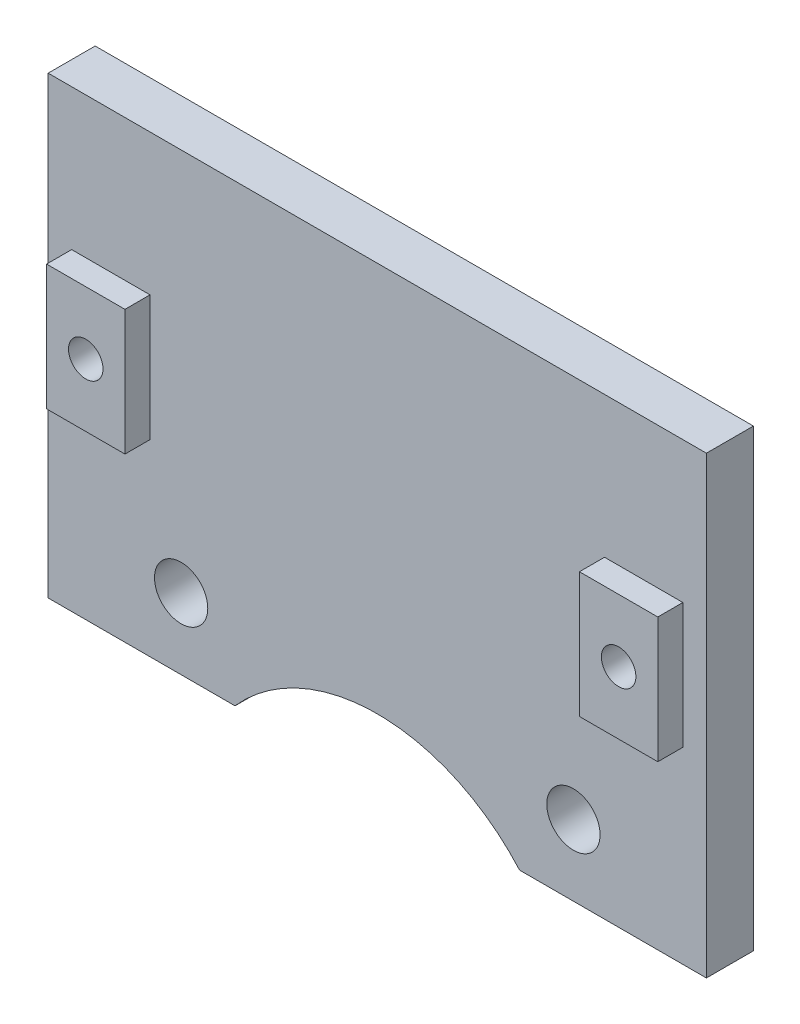
ISO-10303-21;
HEADER;
FILE_DESCRIPTION(('STEP AP214'),'2;1');
FILE_NAME('part.step','',(''),(''),'','','');
FILE_SCHEMA(('AUTOMOTIVE_DESIGN { 1 0 10303 214 1 1 1 1 }'));
ENDSEC;
DATA;
#1=APPLICATION_CONTEXT('core data for automotive mechanical design processes');
#2=APPLICATION_PROTOCOL_DEFINITION('international standard','automotive_design',2000,#1);
#3=PRODUCT_CONTEXT('',#1,'mechanical');
#4=PRODUCT('Part','Part','',(#3));
#5=PRODUCT_RELATED_PRODUCT_CATEGORY('part','',(#4));
#6=PRODUCT_DEFINITION_FORMATION('','',#4);
#7=PRODUCT_DEFINITION_CONTEXT('part definition',#1,'design');
#8=PRODUCT_DEFINITION('design','',#6,#7);
#9=PRODUCT_DEFINITION_SHAPE('','',#8);
#10=(LENGTH_UNIT() NAMED_UNIT(*) SI_UNIT(.MILLI.,.METRE.));
#11=(NAMED_UNIT(*) PLANE_ANGLE_UNIT() SI_UNIT($,.RADIAN.));
#12=(NAMED_UNIT(*) SI_UNIT($,.STERADIAN.) SOLID_ANGLE_UNIT());
#13=UNCERTAINTY_MEASURE_WITH_UNIT(LENGTH_MEASURE(1.E-05),#10,'distance_accuracy_value','');
#14=(GEOMETRIC_REPRESENTATION_CONTEXT(3) GLOBAL_UNCERTAINTY_ASSIGNED_CONTEXT((#13)) GLOBAL_UNIT_ASSIGNED_CONTEXT((#10,
#11,#12)) REPRESENTATION_CONTEXT('',''));
#15=CARTESIAN_POINT('',(0.,0.,0.));
#16=DIRECTION('',(0.,0.,1.));
#17=DIRECTION('',(1.,0.,0.));
#18=AXIS2_PLACEMENT_3D('',#15,#16,#17);
#19=CARTESIAN_POINT('',(0.,0.,3.));
#20=DIRECTION('',(0.,0.,1.));
#21=DIRECTION('',(1.,0.,0.));
#22=AXIS2_PLACEMENT_3D('',#19,#20,#21);
#23=PLANE('',#22);
#24=CARTESIAN_POINT('',(12.5157900270019,-11.4842099729981,3.));
#25=DIRECTION('',(0.,0.,1.));
#26=DIRECTION('',(1.,0.,0.));
#27=AXIS2_PLACEMENT_3D('',#24,#25,#26);
#28=CIRCLE('',#27,1.7);
#29=CARTESIAN_POINT('',(14.2157900270019,-11.4842099729981,3.));
#30=VERTEX_POINT('',#29);
#31=EDGE_CURVE('E199',#30,#30,#28,.F.);
#32=ORIENTED_EDGE('',*,*,#31,.T.);
#33=EDGE_LOOP('',(#32));
#34=FACE_BOUND('',#33,.T.);
#35=CARTESIAN_POINT('',(-12.5157900270019,-11.4842099729981,3.));
#36=DIRECTION('',(0.,0.,1.));
#37=DIRECTION('',(1.,0.,0.));
#38=AXIS2_PLACEMENT_3D('',#35,#36,#37);
#39=CIRCLE('',#38,1.7);
#40=CARTESIAN_POINT('',(-10.8157900270019,-11.4842099729981,3.));
#41=VERTEX_POINT('',#40);
#42=EDGE_CURVE('E203',#41,#41,#39,.F.);
#43=ORIENTED_EDGE('',*,*,#42,.T.);
#44=EDGE_LOOP('',(#43));
#45=FACE_BOUND('',#44,.T.);
#46=DIRECTION('',(1.,0.,0.));
#47=VECTOR('',#46,1.);
#48=CARTESIAN_POINT('',(-21.,-16.,3.));
#49=LINE('',#48,#47);
#50=CARTESIAN_POINT('',(-21.,-16.,3.));
#51=VERTEX_POINT('',#50);
#52=CARTESIAN_POINT('',(-9.07799537342909,-16.,3.));
#53=VERTEX_POINT('',#52);
#54=EDGE_CURVE('E219',#51,#53,#49,.T.);
#55=ORIENTED_EDGE('',*,*,#54,.T.);
#56=CARTESIAN_POINT('',(0.,-24.,3.));
#57=DIRECTION('',(0.,0.,1.));
#58=DIRECTION('',(1.,0.,0.));
#59=AXIS2_PLACEMENT_3D('',#56,#57,#58);
#60=CIRCLE('',#59,12.1);
#61=CARTESIAN_POINT('',(9.07799537342909,-16.,3.));
#62=VERTEX_POINT('',#61);
#63=EDGE_CURVE('E206',#53,#62,#60,.F.);
#64=ORIENTED_EDGE('',*,*,#63,.T.);
#65=CARTESIAN_POINT('',(21.,-16.,3.));
#66=VERTEX_POINT('',#65);
#67=EDGE_CURVE('E213',#62,#66,#49,.T.);
#68=ORIENTED_EDGE('',*,*,#67,.T.);
#69=DIRECTION('',(0.,1.,0.));
#70=VECTOR('',#69,1.);
#71=CARTESIAN_POINT('',(21.,-16.,3.));
#72=LINE('',#71,#70);
#73=CARTESIAN_POINT('',(21.,13.,3.));
#74=VERTEX_POINT('',#73);
#75=EDGE_CURVE('E216',#66,#74,#72,.T.);
#76=ORIENTED_EDGE('',*,*,#75,.T.);
#77=DIRECTION('',(-1.,0.,0.));
#78=VECTOR('',#77,1.);
#79=CARTESIAN_POINT('',(21.,13.,3.));
#80=LINE('',#79,#78);
#81=CARTESIAN_POINT('',(-21.,13.,3.));
#82=VERTEX_POINT('',#81);
#83=EDGE_CURVE('E225',#74,#82,#80,.T.);
#84=ORIENTED_EDGE('',*,*,#83,.T.);
#85=DIRECTION('',(0.,-1.,0.));
#86=VECTOR('',#85,1.);
#87=CARTESIAN_POINT('',(-21.,13.,3.));
#88=LINE('',#87,#86);
#89=EDGE_CURVE('E215',#82,#51,#88,.T.);
#90=ORIENTED_EDGE('',*,*,#89,.T.);
#91=EDGE_LOOP('',(#55,#64,#68,#76,#84,#90));
#92=FACE_BOUND('',#91,.T.);
#93=DIRECTION('',(-1.,0.,0.));
#94=VECTOR('',#93,1.);
#95=CARTESIAN_POINT('',(0.,-4.,3.));
#96=LINE('',#95,#94);
#97=CARTESIAN_POINT('',(-14.5,-4.,3.));
#98=VERTEX_POINT('',#97);
#99=CARTESIAN_POINT('',(-19.5,-4.,3.));
#100=VERTEX_POINT('',#99);
#101=EDGE_CURVE('E260',#98,#100,#96,.T.);
#102=ORIENTED_EDGE('',*,*,#101,.T.);
#103=DIRECTION('',(0.,1.,0.));
#104=VECTOR('',#103,1.);
#105=CARTESIAN_POINT('',(-19.5,0.,3.));
#106=LINE('',#105,#104);
#107=CARTESIAN_POINT('',(-19.5,4.,3.));
#108=VERTEX_POINT('',#107);
#109=EDGE_CURVE('E258',#100,#108,#106,.T.);
#110=ORIENTED_EDGE('',*,*,#109,.T.);
#111=DIRECTION('',(1.,0.,0.));
#112=VECTOR('',#111,1.);
#113=CARTESIAN_POINT('',(0.,4.,3.));
#114=LINE('',#113,#112);
#115=CARTESIAN_POINT('',(-14.5,4.,3.));
#116=VERTEX_POINT('',#115);
#117=EDGE_CURVE('E250',#108,#116,#114,.T.);
#118=ORIENTED_EDGE('',*,*,#117,.T.);
#119=DIRECTION('',(0.,-1.,0.));
#120=VECTOR('',#119,1.);
#121=CARTESIAN_POINT('',(-14.5,0.,3.));
#122=LINE('',#121,#120);
#123=EDGE_CURVE('E251',#116,#98,#122,.T.);
#124=ORIENTED_EDGE('',*,*,#123,.T.);
#125=EDGE_LOOP('',(#102,#110,#118,#124));
#126=FACE_BOUND('',#125,.T.);
#127=DIRECTION('',(-1.,0.,0.));
#128=VECTOR('',#127,1.);
#129=CARTESIAN_POINT('',(0.,-4.,3.));
#130=LINE('',#129,#128);
#131=CARTESIAN_POINT('',(19.5,-4.,3.));
#132=VERTEX_POINT('',#131);
#133=CARTESIAN_POINT('',(14.5,-4.,3.));
#134=VERTEX_POINT('',#133);
#135=EDGE_CURVE('E49',#132,#134,#130,.T.);
#136=ORIENTED_EDGE('',*,*,#135,.T.);
#137=DIRECTION('',(0.,1.,0.));
#138=VECTOR('',#137,1.);
#139=CARTESIAN_POINT('',(14.5,0.,3.));
#140=LINE('',#139,#138);
#141=CARTESIAN_POINT('',(14.5,4.,3.));
#142=VERTEX_POINT('',#141);
#143=EDGE_CURVE('E11',#134,#142,#140,.T.);
#144=ORIENTED_EDGE('',*,*,#143,.T.);
#145=DIRECTION('',(1.,0.,0.));
#146=VECTOR('',#145,1.);
#147=CARTESIAN_POINT('',(0.,4.,3.));
#148=LINE('',#147,#146);
#149=CARTESIAN_POINT('',(19.5,4.,3.));
#150=VERTEX_POINT('',#149);
#151=EDGE_CURVE('E262',#142,#150,#148,.T.);
#152=ORIENTED_EDGE('',*,*,#151,.T.);
#153=DIRECTION('',(0.,-1.,0.));
#154=VECTOR('',#153,1.);
#155=CARTESIAN_POINT('',(19.5,0.,3.));
#156=LINE('',#155,#154);
#157=EDGE_CURVE('E271',#150,#132,#156,.T.);
#158=ORIENTED_EDGE('',*,*,#157,.T.);
#159=EDGE_LOOP('',(#136,#144,#152,#158));
#160=FACE_BOUND('',#159,.T.);
#161=ADVANCED_FACE('F41',(#34,#45,#92,#126,#160),#23,.T.);
#162=CARTESIAN_POINT('',(-21.,-16.,3.));
#163=DIRECTION('',(0.,1.,0.));
#164=DIRECTION('',(0.,0.,1.));
#165=AXIS2_PLACEMENT_3D('',#162,#163,#164);
#166=PLANE('',#165);
#167=DIRECTION('',(0.,0.,-1.));
#168=VECTOR('',#167,1.);
#169=CARTESIAN_POINT('',(9.07799537342909,-16.,3.1));
#170=LINE('',#169,#168);
#171=CARTESIAN_POINT('',(9.07799537342909,-16.,0.));
#172=VERTEX_POINT('',#171);
#173=EDGE_CURVE('E207',#172,#62,#170,.F.);
#174=ORIENTED_EDGE('',*,*,#173,.F.);
#175=DIRECTION('',(1.,0.,0.));
#176=VECTOR('',#175,1.);
#177=CARTESIAN_POINT('',(-21.,-16.,0.));
#178=LINE('',#177,#176);
#179=CARTESIAN_POINT('',(21.,-16.,0.));
#180=VERTEX_POINT('',#179);
#181=EDGE_CURVE('E227',#172,#180,#178,.T.);
#182=ORIENTED_EDGE('',*,*,#181,.T.);
#183=DIRECTION('',(0.,0.,-1.));
#184=VECTOR('',#183,1.);
#185=CARTESIAN_POINT('',(21.,-16.,3.));
#186=LINE('',#185,#184);
#187=EDGE_CURVE('E237',#66,#180,#186,.T.);
#188=ORIENTED_EDGE('',*,*,#187,.F.);
#189=ORIENTED_EDGE('',*,*,#67,.F.);
#190=EDGE_LOOP('',(#174,#182,#188,#189));
#191=FACE_BOUND('',#190,.T.);
#192=ADVANCED_FACE('F310',(#191),#166,.F.);
#193=DIRECTION('',(0.,0.,-1.));
#194=VECTOR('',#193,1.);
#195=CARTESIAN_POINT('',(-9.07799537342909,-16.,3.1));
#196=LINE('',#195,#194);
#197=CARTESIAN_POINT('',(-9.07799537342909,-16.,0.));
#198=VERTEX_POINT('',#197);
#199=EDGE_CURVE('E202',#53,#198,#196,.T.);
#200=ORIENTED_EDGE('',*,*,#199,.F.);
#201=ORIENTED_EDGE('',*,*,#54,.F.);
#202=DIRECTION('',(0.,0.,-1.));
#203=VECTOR('',#202,1.);
#204=CARTESIAN_POINT('',(-21.,-16.,3.));
#205=LINE('',#204,#203);
#206=CARTESIAN_POINT('',(-21.,-16.,0.));
#207=VERTEX_POINT('',#206);
#208=EDGE_CURVE('E245',#51,#207,#205,.T.);
#209=ORIENTED_EDGE('',*,*,#208,.T.);
#210=EDGE_CURVE('E226',#207,#198,#178,.T.);
#211=ORIENTED_EDGE('',*,*,#210,.T.);
#212=EDGE_LOOP('',(#200,#201,#209,#211));
#213=FACE_BOUND('',#212,.T.);
#214=ADVANCED_FACE('F314',(#213),#166,.F.);
#215=CARTESIAN_POINT('',(-21.,13.,3.));
#216=DIRECTION('',(1.,0.,0.));
#217=DIRECTION('',(0.,0.,-1.));
#218=AXIS2_PLACEMENT_3D('',#215,#216,#217);
#219=PLANE('',#218);
#220=DIRECTION('',(0.,-1.,0.));
#221=VECTOR('',#220,1.);
#222=CARTESIAN_POINT('',(-21.,13.,0.));
#223=LINE('',#222,#221);
#224=CARTESIAN_POINT('',(-21.,13.,0.));
#225=VERTEX_POINT('',#224);
#226=EDGE_CURVE('E212',#225,#207,#223,.T.);
#227=ORIENTED_EDGE('',*,*,#226,.T.);
#228=ORIENTED_EDGE('',*,*,#208,.F.);
#229=ORIENTED_EDGE('',*,*,#89,.F.);
#230=DIRECTION('',(0.,0.,-1.));
#231=VECTOR('',#230,1.);
#232=CARTESIAN_POINT('',(-21.,13.,3.));
#233=LINE('',#232,#231);
#234=EDGE_CURVE('E222',#82,#225,#233,.T.);
#235=ORIENTED_EDGE('',*,*,#234,.T.);
#236=EDGE_LOOP('',(#227,#228,#229,#235));
#237=FACE_BOUND('',#236,.T.);
#238=ADVANCED_FACE('F43',(#237),#219,.F.);
#239=CARTESIAN_POINT('',(21.,-16.,3.));
#240=DIRECTION('',(-1.,0.,0.));
#241=DIRECTION('',(0.,0.,1.));
#242=AXIS2_PLACEMENT_3D('',#239,#240,#241);
#243=PLANE('',#242);
#244=DIRECTION('',(0.,1.,0.));
#245=VECTOR('',#244,1.);
#246=CARTESIAN_POINT('',(21.,-16.,0.));
#247=LINE('',#246,#245);
#248=CARTESIAN_POINT('',(21.,13.,0.));
#249=VERTEX_POINT('',#248);
#250=EDGE_CURVE('E233',#180,#249,#247,.T.);
#251=ORIENTED_EDGE('',*,*,#250,.T.);
#252=DIRECTION('',(0.,0.,-1.));
#253=VECTOR('',#252,1.);
#254=CARTESIAN_POINT('',(21.,13.,3.));
#255=LINE('',#254,#253);
#256=EDGE_CURVE('E236',#74,#249,#255,.T.);
#257=ORIENTED_EDGE('',*,*,#256,.F.);
#258=ORIENTED_EDGE('',*,*,#75,.F.);
#259=ORIENTED_EDGE('',*,*,#187,.T.);
#260=EDGE_LOOP('',(#251,#257,#258,#259));
#261=FACE_BOUND('',#260,.T.);
#262=ADVANCED_FACE('F330',(#261),#243,.F.);
#263=CARTESIAN_POINT('',(21.,13.,3.));
#264=DIRECTION('',(0.,-1.,0.));
#265=DIRECTION('',(0.,0.,-1.));
#266=AXIS2_PLACEMENT_3D('',#263,#264,#265);
#267=PLANE('',#266);
#268=DIRECTION('',(-1.,0.,0.));
#269=VECTOR('',#268,1.);
#270=CARTESIAN_POINT('',(21.,13.,0.));
#271=LINE('',#270,#269);
#272=EDGE_CURVE('E218',#249,#225,#271,.T.);
#273=ORIENTED_EDGE('',*,*,#272,.T.);
#274=ORIENTED_EDGE('',*,*,#234,.F.);
#275=ORIENTED_EDGE('',*,*,#83,.F.);
#276=ORIENTED_EDGE('',*,*,#256,.T.);
#277=EDGE_LOOP('',(#273,#274,#275,#276));
#278=FACE_BOUND('',#277,.T.);
#279=ADVANCED_FACE('F323',(#278),#267,.F.);
#280=CARTESIAN_POINT('',(0.,0.,0.));
#281=DIRECTION('',(0.,0.,1.));
#282=DIRECTION('',(1.,0.,0.));
#283=AXIS2_PLACEMENT_3D('',#280,#281,#282);
#284=PLANE('',#283);
#285=CARTESIAN_POINT('',(17.,0.,0.));
#286=DIRECTION('',(0.,0.,1.));
#287=DIRECTION('',(1.,0.,0.));
#288=AXIS2_PLACEMENT_3D('',#285,#286,#287);
#289=CIRCLE('',#288,1.6);
#290=CARTESIAN_POINT('',(18.6,0.,0.));
#291=VERTEX_POINT('',#290);
#292=EDGE_CURVE('E44',#291,#291,#289,.F.);
#293=ORIENTED_EDGE('',*,*,#292,.F.);
#294=EDGE_LOOP('',(#293));
#295=FACE_BOUND('',#294,.T.);
#296=CARTESIAN_POINT('',(-17.,0.,0.));
#297=DIRECTION('',(0.,0.,1.));
#298=DIRECTION('',(1.,0.,0.));
#299=AXIS2_PLACEMENT_3D('',#296,#297,#298);
#300=CIRCLE('',#299,1.6);
#301=CARTESIAN_POINT('',(-15.4,0.,0.));
#302=VERTEX_POINT('',#301);
#303=EDGE_CURVE('E268',#302,#302,#300,.F.);
#304=ORIENTED_EDGE('',*,*,#303,.F.);
#305=EDGE_LOOP('',(#304));
#306=FACE_BOUND('',#305,.T.);
#307=CARTESIAN_POINT('',(12.5157900270019,-11.4842099729981,0.));
#308=DIRECTION('',(0.,0.,1.));
#309=DIRECTION('',(1.,0.,0.));
#310=AXIS2_PLACEMENT_3D('',#307,#308,#309);
#311=CIRCLE('',#310,1.7);
#312=CARTESIAN_POINT('',(14.2157900270019,-11.4842099729981,0.));
#313=VERTEX_POINT('',#312);
#314=EDGE_CURVE('E198',#313,#313,#311,.F.);
#315=ORIENTED_EDGE('',*,*,#314,.F.);
#316=EDGE_LOOP('',(#315));
#317=FACE_BOUND('',#316,.T.);
#318=CARTESIAN_POINT('',(-12.5157900270019,-11.4842099729981,0.));
#319=DIRECTION('',(0.,0.,1.));
#320=DIRECTION('',(1.,0.,0.));
#321=AXIS2_PLACEMENT_3D('',#318,#319,#320);
#322=CIRCLE('',#321,1.7);
#323=CARTESIAN_POINT('',(-10.8157900270019,-11.4842099729981,0.));
#324=VERTEX_POINT('',#323);
#325=EDGE_CURVE('E196',#324,#324,#322,.F.);
#326=ORIENTED_EDGE('',*,*,#325,.F.);
#327=EDGE_LOOP('',(#326));
#328=FACE_BOUND('',#327,.T.);
#329=CARTESIAN_POINT('',(0.,-24.,0.));
#330=DIRECTION('',(0.,0.,1.));
#331=DIRECTION('',(1.,0.,0.));
#332=AXIS2_PLACEMENT_3D('',#329,#330,#331);
#333=CIRCLE('',#332,12.1);
#334=EDGE_CURVE('E244',#198,#172,#333,.F.);
#335=ORIENTED_EDGE('',*,*,#334,.F.);
#336=ORIENTED_EDGE('',*,*,#210,.F.);
#337=ORIENTED_EDGE('',*,*,#226,.F.);
#338=ORIENTED_EDGE('',*,*,#272,.F.);
#339=ORIENTED_EDGE('',*,*,#250,.F.);
#340=ORIENTED_EDGE('',*,*,#181,.F.);
#341=EDGE_LOOP('',(#335,#336,#337,#338,#339,#340));
#342=FACE_BOUND('',#341,.T.);
#343=ADVANCED_FACE('F325',(#295,#306,#317,#328,#342),#284,.F.);
#344=CARTESIAN_POINT('',(0.,-24.,3.1));
#345=DIRECTION('',(0.,0.,-1.));
#346=DIRECTION('',(-1.,0.,0.));
#347=AXIS2_PLACEMENT_3D('',#344,#345,#346);
#348=CYLINDRICAL_SURFACE('',#347,12.1);
#349=ORIENTED_EDGE('',*,*,#199,.T.);
#350=ORIENTED_EDGE('',*,*,#334,.T.);
#351=ORIENTED_EDGE('',*,*,#173,.T.);
#352=ORIENTED_EDGE('',*,*,#63,.F.);
#353=EDGE_LOOP('',(#349,#350,#351,#352));
#354=FACE_BOUND('',#353,.T.);
#355=ADVANCED_FACE('F318',(#354),#348,.F.);
#356=CARTESIAN_POINT('',(-12.5157900270019,-11.4842099729981,3.1));
#357=DIRECTION('',(0.,0.,-1.));
#358=DIRECTION('',(-1.,0.,0.));
#359=AXIS2_PLACEMENT_3D('',#356,#357,#358);
#360=CYLINDRICAL_SURFACE('',#359,1.7);
#361=ORIENTED_EDGE('',*,*,#42,.F.);
#362=EDGE_LOOP('',(#361));
#363=FACE_BOUND('',#362,.T.);
#364=ORIENTED_EDGE('',*,*,#325,.T.);
#365=EDGE_LOOP('',(#364));
#366=FACE_BOUND('',#365,.T.);
#367=ADVANCED_FACE('F356',(#363,#366),#360,.F.);
#368=CARTESIAN_POINT('',(12.5157900270019,-11.4842099729981,3.1));
#369=DIRECTION('',(0.,0.,-1.));
#370=DIRECTION('',(-1.,0.,0.));
#371=AXIS2_PLACEMENT_3D('',#368,#369,#370);
#372=CYLINDRICAL_SURFACE('',#371,1.7);
#373=ORIENTED_EDGE('',*,*,#31,.F.);
#374=EDGE_LOOP('',(#373));
#375=FACE_BOUND('',#374,.T.);
#376=ORIENTED_EDGE('',*,*,#314,.T.);
#377=EDGE_LOOP('',(#376));
#378=FACE_BOUND('',#377,.T.);
#379=ADVANCED_FACE('F361',(#375,#378),#372,.F.);
#380=CARTESIAN_POINT('',(-19.5,4.,4.6));
#381=DIRECTION('',(1.,0.,0.));
#382=DIRECTION('',(0.,0.,-1.));
#383=AXIS2_PLACEMENT_3D('',#380,#381,#382);
#384=PLANE('',#383);
#385=ORIENTED_EDGE('',*,*,#109,.F.);
#386=DIRECTION('',(0.,0.,-1.));
#387=VECTOR('',#386,1.);
#388=CARTESIAN_POINT('',(-19.5,-4.,4.6));
#389=LINE('',#388,#387);
#390=CARTESIAN_POINT('',(-19.5,-4.,4.6));
#391=VERTEX_POINT('',#390);
#392=EDGE_CURVE('E194',#391,#100,#389,.T.);
#393=ORIENTED_EDGE('',*,*,#392,.F.);
#394=DIRECTION('',(0.,-1.,0.));
#395=VECTOR('',#394,1.);
#396=CARTESIAN_POINT('',(-19.5,4.,4.6));
#397=LINE('',#396,#395);
#398=CARTESIAN_POINT('',(-19.5,4.,4.6));
#399=VERTEX_POINT('',#398);
#400=EDGE_CURVE('E176',#399,#391,#397,.T.);
#401=ORIENTED_EDGE('',*,*,#400,.F.);
#402=DIRECTION('',(0.,0.,-1.));
#403=VECTOR('',#402,1.);
#404=CARTESIAN_POINT('',(-19.5,4.,4.6));
#405=LINE('',#404,#403);
#406=EDGE_CURVE('E187',#399,#108,#405,.T.);
#407=ORIENTED_EDGE('',*,*,#406,.T.);
#408=EDGE_LOOP('',(#385,#393,#401,#407));
#409=FACE_BOUND('',#408,.T.);
#410=ADVANCED_FACE('F368',(#409),#384,.F.);
#411=CARTESIAN_POINT('',(-19.5,-4.,4.6));
#412=DIRECTION('',(0.,1.,0.));
#413=DIRECTION('',(0.,0.,1.));
#414=AXIS2_PLACEMENT_3D('',#411,#412,#413);
#415=PLANE('',#414);
#416=ORIENTED_EDGE('',*,*,#101,.F.);
#417=DIRECTION('',(0.,0.,-1.));
#418=VECTOR('',#417,1.);
#419=CARTESIAN_POINT('',(-14.5,-4.,4.6));
#420=LINE('',#419,#418);
#421=CARTESIAN_POINT('',(-14.5,-4.,4.6));
#422=VERTEX_POINT('',#421);
#423=EDGE_CURVE('E188',#422,#98,#420,.T.);
#424=ORIENTED_EDGE('',*,*,#423,.F.);
#425=DIRECTION('',(1.,0.,0.));
#426=VECTOR('',#425,1.);
#427=CARTESIAN_POINT('',(-19.5,-4.,4.6));
#428=LINE('',#427,#426);
#429=EDGE_CURVE('E177',#391,#422,#428,.T.);
#430=ORIENTED_EDGE('',*,*,#429,.F.);
#431=ORIENTED_EDGE('',*,*,#392,.T.);
#432=EDGE_LOOP('',(#416,#424,#430,#431));
#433=FACE_BOUND('',#432,.T.);
#434=ADVANCED_FACE('F376',(#433),#415,.F.);
#435=CARTESIAN_POINT('',(-14.5,-4.,4.6));
#436=DIRECTION('',(-1.,0.,0.));
#437=DIRECTION('',(0.,0.,1.));
#438=AXIS2_PLACEMENT_3D('',#435,#436,#437);
#439=PLANE('',#438);
#440=ORIENTED_EDGE('',*,*,#123,.F.);
#441=DIRECTION('',(0.,0.,-1.));
#442=VECTOR('',#441,1.);
#443=CARTESIAN_POINT('',(-14.5,4.,4.6));
#444=LINE('',#443,#442);
#445=CARTESIAN_POINT('',(-14.5,4.,4.6));
#446=VERTEX_POINT('',#445);
#447=EDGE_CURVE('E68',#446,#116,#444,.T.);
#448=ORIENTED_EDGE('',*,*,#447,.F.);
#449=DIRECTION('',(0.,1.,0.));
#450=VECTOR('',#449,1.);
#451=CARTESIAN_POINT('',(-14.5,-4.,4.6));
#452=LINE('',#451,#450);
#453=EDGE_CURVE('E185',#422,#446,#452,.T.);
#454=ORIENTED_EDGE('',*,*,#453,.F.);
#455=ORIENTED_EDGE('',*,*,#423,.T.);
#456=EDGE_LOOP('',(#440,#448,#454,#455));
#457=FACE_BOUND('',#456,.T.);
#458=ADVANCED_FACE('F379',(#457),#439,.F.);
#459=CARTESIAN_POINT('',(-14.5,4.,4.6));
#460=DIRECTION('',(0.,-1.,0.));
#461=DIRECTION('',(0.,0.,-1.));
#462=AXIS2_PLACEMENT_3D('',#459,#460,#461);
#463=PLANE('',#462);
#464=ORIENTED_EDGE('',*,*,#117,.F.);
#465=ORIENTED_EDGE('',*,*,#406,.F.);
#466=DIRECTION('',(-1.,0.,0.));
#467=VECTOR('',#466,1.);
#468=CARTESIAN_POINT('',(-14.5,4.,4.6));
#469=LINE('',#468,#467);
#470=EDGE_CURVE('E183',#446,#399,#469,.T.);
#471=ORIENTED_EDGE('',*,*,#470,.F.);
#472=ORIENTED_EDGE('',*,*,#447,.T.);
#473=EDGE_LOOP('',(#464,#465,#471,#472));
#474=FACE_BOUND('',#473,.T.);
#475=ADVANCED_FACE('F381',(#474),#463,.F.);
#476=CARTESIAN_POINT('',(0.,0.,4.6));
#477=DIRECTION('',(0.,0.,1.));
#478=DIRECTION('',(1.,0.,0.));
#479=AXIS2_PLACEMENT_3D('',#476,#477,#478);
#480=PLANE('',#479);
#481=CARTESIAN_POINT('',(-17.,0.,4.6));
#482=DIRECTION('',(0.,0.,1.));
#483=DIRECTION('',(1.,0.,0.));
#484=AXIS2_PLACEMENT_3D('',#481,#482,#483);
#485=CIRCLE('',#484,1.1);
#486=CARTESIAN_POINT('',(-15.9,0.,4.6));
#487=VERTEX_POINT('',#486);
#488=EDGE_CURVE('E179',#487,#487,#485,.F.);
#489=ORIENTED_EDGE('',*,*,#488,.T.);
#490=EDGE_LOOP('',(#489));
#491=FACE_BOUND('',#490,.T.);
#492=ORIENTED_EDGE('',*,*,#400,.T.);
#493=ORIENTED_EDGE('',*,*,#429,.T.);
#494=ORIENTED_EDGE('',*,*,#453,.T.);
#495=ORIENTED_EDGE('',*,*,#470,.T.);
#496=EDGE_LOOP('',(#492,#493,#494,#495));
#497=FACE_BOUND('',#496,.T.);
#498=ADVANCED_FACE('F389',(#491,#497),#480,.T.);
#499=CARTESIAN_POINT('',(-17.,0.,4.7));
#500=DIRECTION('',(0.,0.,-1.));
#501=DIRECTION('',(-1.,0.,0.));
#502=AXIS2_PLACEMENT_3D('',#499,#500,#501);
#503=CYLINDRICAL_SURFACE('',#502,1.1);
#504=CARTESIAN_POINT('',(-17.,0.,2.4));
#505=DIRECTION('',(0.,0.,1.));
#506=DIRECTION('',(1.,0.,0.));
#507=AXIS2_PLACEMENT_3D('',#504,#505,#506);
#508=CIRCLE('',#507,1.1);
#509=CARTESIAN_POINT('',(-15.9,0.,2.4));
#510=VERTEX_POINT('',#509);
#511=EDGE_CURVE('E171',#510,#510,#508,.T.);
#512=ORIENTED_EDGE('',*,*,#511,.F.);
#513=EDGE_LOOP('',(#512));
#514=FACE_BOUND('',#513,.T.);
#515=ORIENTED_EDGE('',*,*,#488,.F.);
#516=EDGE_LOOP('',(#515));
#517=FACE_BOUND('',#516,.T.);
#518=ADVANCED_FACE('F393',(#514,#517),#503,.F.);
#519=CARTESIAN_POINT('',(-17.,0.,2.4));
#520=DIRECTION('',(0.,0.,-1.));
#521=DIRECTION('',(-1.,0.,0.));
#522=AXIS2_PLACEMENT_3D('',#519,#520,#521);
#523=CYLINDRICAL_SURFACE('',#522,1.6);
#524=CARTESIAN_POINT('',(-17.,0.,2.4));
#525=DIRECTION('',(0.,0.,1.));
#526=DIRECTION('',(1.,0.,0.));
#527=AXIS2_PLACEMENT_3D('',#524,#525,#526);
#528=CIRCLE('',#527,1.6);
#529=CARTESIAN_POINT('',(-15.4,0.,2.4));
#530=VERTEX_POINT('',#529);
#531=EDGE_CURVE('E166',#530,#530,#528,.T.);
#532=ORIENTED_EDGE('',*,*,#531,.T.);
#533=EDGE_LOOP('',(#532));
#534=FACE_BOUND('',#533,.T.);
#535=ORIENTED_EDGE('',*,*,#303,.T.);
#536=EDGE_LOOP('',(#535));
#537=FACE_BOUND('',#536,.T.);
#538=ADVANCED_FACE('F391',(#534,#537),#523,.F.);
#539=CARTESIAN_POINT('',(-17.,0.,2.4));
#540=DIRECTION('',(0.,0.,1.));
#541=DIRECTION('',(1.,0.,0.));
#542=AXIS2_PLACEMENT_3D('',#539,#540,#541);
#543=PLANE('',#542);
#544=ORIENTED_EDGE('',*,*,#511,.T.);
#545=EDGE_LOOP('',(#544));
#546=FACE_BOUND('',#545,.T.);
#547=ORIENTED_EDGE('',*,*,#531,.F.);
#548=EDGE_LOOP('',(#547));
#549=FACE_BOUND('',#548,.T.);
#550=ADVANCED_FACE('F397',(#546,#549),#543,.F.);
#551=CARTESIAN_POINT('',(14.5,4.,4.6));
#552=DIRECTION('',(1.,0.,0.));
#553=DIRECTION('',(0.,0.,-1.));
#554=AXIS2_PLACEMENT_3D('',#551,#552,#553);
#555=PLANE('',#554);
#556=ORIENTED_EDGE('',*,*,#143,.F.);
#557=DIRECTION('',(0.,0.,-1.));
#558=VECTOR('',#557,1.);
#559=CARTESIAN_POINT('',(14.5,-4.,4.6));
#560=LINE('',#559,#558);
#561=CARTESIAN_POINT('',(14.5,-4.,4.6));
#562=VERTEX_POINT('',#561);
#563=EDGE_CURVE('E148',#562,#134,#560,.T.);
#564=ORIENTED_EDGE('',*,*,#563,.F.);
#565=DIRECTION('',(0.,-1.,0.));
#566=VECTOR('',#565,1.);
#567=CARTESIAN_POINT('',(14.5,4.,4.6));
#568=LINE('',#567,#566);
#569=CARTESIAN_POINT('',(14.5,4.,4.6));
#570=VERTEX_POINT('',#569);
#571=EDGE_CURVE('E160',#570,#562,#568,.T.);
#572=ORIENTED_EDGE('',*,*,#571,.F.);
#573=DIRECTION('',(0.,0.,-1.));
#574=VECTOR('',#573,1.);
#575=CARTESIAN_POINT('',(14.5,4.,4.6));
#576=LINE('',#575,#574);
#577=EDGE_CURVE('E293',#570,#142,#576,.T.);
#578=ORIENTED_EDGE('',*,*,#577,.T.);
#579=EDGE_LOOP('',(#556,#564,#572,#578));
#580=FACE_BOUND('',#579,.T.);
#581=ADVANCED_FACE('F170',(#580),#555,.F.);
#582=CARTESIAN_POINT('',(14.5,-4.,4.6));
#583=DIRECTION('',(0.,1.,0.));
#584=DIRECTION('',(0.,0.,1.));
#585=AXIS2_PLACEMENT_3D('',#582,#583,#584);
#586=PLANE('',#585);
#587=ORIENTED_EDGE('',*,*,#135,.F.);
#588=DIRECTION('',(0.,0.,-1.));
#589=VECTOR('',#588,1.);
#590=CARTESIAN_POINT('',(19.5,-4.,4.6));
#591=LINE('',#590,#589);
#592=CARTESIAN_POINT('',(19.5,-4.,4.6));
#593=VERTEX_POINT('',#592);
#594=EDGE_CURVE('E152',#593,#132,#591,.T.);
#595=ORIENTED_EDGE('',*,*,#594,.F.);
#596=DIRECTION('',(1.,0.,0.));
#597=VECTOR('',#596,1.);
#598=CARTESIAN_POINT('',(14.5,-4.,4.6));
#599=LINE('',#598,#597);
#600=EDGE_CURVE('E147',#562,#593,#599,.T.);
#601=ORIENTED_EDGE('',*,*,#600,.F.);
#602=ORIENTED_EDGE('',*,*,#563,.T.);
#603=EDGE_LOOP('',(#587,#595,#601,#602));
#604=FACE_BOUND('',#603,.T.);
#605=ADVANCED_FACE('F149',(#604),#586,.F.);
#606=CARTESIAN_POINT('',(19.5,-4.,4.6));
#607=DIRECTION('',(-1.,0.,0.));
#608=DIRECTION('',(0.,0.,1.));
#609=AXIS2_PLACEMENT_3D('',#606,#607,#608);
#610=PLANE('',#609);
#611=ORIENTED_EDGE('',*,*,#157,.F.);
#612=DIRECTION('',(0.,0.,-1.));
#613=VECTOR('',#612,1.);
#614=CARTESIAN_POINT('',(19.5,4.,4.6));
#615=LINE('',#614,#613);
#616=CARTESIAN_POINT('',(19.5,4.,4.6));
#617=VERTEX_POINT('',#616);
#618=EDGE_CURVE('E59',#617,#150,#615,.T.);
#619=ORIENTED_EDGE('',*,*,#618,.F.);
#620=DIRECTION('',(0.,1.,0.));
#621=VECTOR('',#620,1.);
#622=CARTESIAN_POINT('',(19.5,-4.,4.6));
#623=LINE('',#622,#621);
#624=EDGE_CURVE('E158',#593,#617,#623,.T.);
#625=ORIENTED_EDGE('',*,*,#624,.F.);
#626=ORIENTED_EDGE('',*,*,#594,.T.);
#627=EDGE_LOOP('',(#611,#619,#625,#626));
#628=FACE_BOUND('',#627,.T.);
#629=ADVANCED_FACE('F295',(#628),#610,.F.);
#630=CARTESIAN_POINT('',(19.5,4.,4.6));
#631=DIRECTION('',(0.,-1.,0.));
#632=DIRECTION('',(0.,0.,-1.));
#633=AXIS2_PLACEMENT_3D('',#630,#631,#632);
#634=PLANE('',#633);
#635=ORIENTED_EDGE('',*,*,#151,.F.);
#636=ORIENTED_EDGE('',*,*,#577,.F.);
#637=DIRECTION('',(-1.,0.,0.));
#638=VECTOR('',#637,1.);
#639=CARTESIAN_POINT('',(19.5,4.,4.6));
#640=LINE('',#639,#638);
#641=EDGE_CURVE('E163',#617,#570,#640,.T.);
#642=ORIENTED_EDGE('',*,*,#641,.F.);
#643=ORIENTED_EDGE('',*,*,#618,.T.);
#644=EDGE_LOOP('',(#635,#636,#642,#643));
#645=FACE_BOUND('',#644,.T.);
#646=ADVANCED_FACE('F294',(#645),#634,.F.);
#647=CARTESIAN_POINT('',(0.,0.,4.6));
#648=DIRECTION('',(0.,0.,1.));
#649=DIRECTION('',(1.,0.,0.));
#650=AXIS2_PLACEMENT_3D('',#647,#648,#649);
#651=PLANE('',#650);
#652=CARTESIAN_POINT('',(17.,0.,4.6));
#653=DIRECTION('',(0.,0.,1.));
#654=DIRECTION('',(1.,0.,0.));
#655=AXIS2_PLACEMENT_3D('',#652,#653,#654);
#656=CIRCLE('',#655,1.1);
#657=CARTESIAN_POINT('',(18.1,0.,4.6));
#658=VERTEX_POINT('',#657);
#659=EDGE_CURVE('E164',#658,#658,#656,.F.);
#660=ORIENTED_EDGE('',*,*,#659,.T.);
#661=EDGE_LOOP('',(#660));
#662=FACE_BOUND('',#661,.T.);
#663=ORIENTED_EDGE('',*,*,#571,.T.);
#664=ORIENTED_EDGE('',*,*,#600,.T.);
#665=ORIENTED_EDGE('',*,*,#624,.T.);
#666=ORIENTED_EDGE('',*,*,#641,.T.);
#667=EDGE_LOOP('',(#663,#664,#665,#666));
#668=FACE_BOUND('',#667,.T.);
#669=ADVANCED_FACE('F159',(#662,#668),#651,.T.);
#670=CARTESIAN_POINT('',(17.,0.,4.7));
#671=DIRECTION('',(0.,0.,-1.));
#672=DIRECTION('',(-1.,0.,0.));
#673=AXIS2_PLACEMENT_3D('',#670,#671,#672);
#674=CYLINDRICAL_SURFACE('',#673,1.1);
#675=CARTESIAN_POINT('',(17.,0.,2.4));
#676=DIRECTION('',(0.,0.,1.));
#677=DIRECTION('',(1.,0.,0.));
#678=AXIS2_PLACEMENT_3D('',#675,#676,#677);
#679=CIRCLE('',#678,1.1);
#680=CARTESIAN_POINT('',(18.1,0.,2.4));
#681=VERTEX_POINT('',#680);
#682=EDGE_CURVE('E279',#681,#681,#679,.T.);
#683=ORIENTED_EDGE('',*,*,#682,.F.);
#684=EDGE_LOOP('',(#683));
#685=FACE_BOUND('',#684,.T.);
#686=ORIENTED_EDGE('',*,*,#659,.F.);
#687=EDGE_LOOP('',(#686));
#688=FACE_BOUND('',#687,.T.);
#689=ADVANCED_FACE('F305',(#685,#688),#674,.F.);
#690=CARTESIAN_POINT('',(17.,0.,2.4));
#691=DIRECTION('',(0.,0.,-1.));
#692=DIRECTION('',(-1.,0.,0.));
#693=AXIS2_PLACEMENT_3D('',#690,#691,#692);
#694=CYLINDRICAL_SURFACE('',#693,1.6);
#695=CARTESIAN_POINT('',(17.,0.,2.4));
#696=DIRECTION('',(0.,0.,1.));
#697=DIRECTION('',(1.,0.,0.));
#698=AXIS2_PLACEMENT_3D('',#695,#696,#697);
#699=CIRCLE('',#698,1.6);
#700=CARTESIAN_POINT('',(18.6,0.,2.4));
#701=VERTEX_POINT('',#700);
#702=EDGE_CURVE('E278',#701,#701,#699,.T.);
#703=ORIENTED_EDGE('',*,*,#702,.T.);
#704=EDGE_LOOP('',(#703));
#705=FACE_BOUND('',#704,.T.);
#706=ORIENTED_EDGE('',*,*,#292,.T.);
#707=EDGE_LOOP('',(#706));
#708=FACE_BOUND('',#707,.T.);
#709=ADVANCED_FACE('F432',(#705,#708),#694,.F.);
#710=CARTESIAN_POINT('',(17.,0.,2.4));
#711=DIRECTION('',(0.,0.,1.));
#712=DIRECTION('',(1.,0.,0.));
#713=AXIS2_PLACEMENT_3D('',#710,#711,#712);
#714=PLANE('',#713);
#715=ORIENTED_EDGE('',*,*,#682,.T.);
#716=EDGE_LOOP('',(#715));
#717=FACE_BOUND('',#716,.T.);
#718=ORIENTED_EDGE('',*,*,#702,.F.);
#719=EDGE_LOOP('',(#718));
#720=FACE_BOUND('',#719,.T.);
#721=ADVANCED_FACE('F443',(#717,#720),#714,.F.);
#722=CLOSED_SHELL('',(#161,#192,#214,#238,#262,#279,#343,#355,#367,#379,#410,#434,#458,#475,
#498,#518,#538,#550,#581,#605,#629,#646,#669,#689,#709,#721));
#723=MANIFOLD_SOLID_BREP('B2',#722);
#724=ADVANCED_BREP_SHAPE_REPRESENTATION('',(#18,#723),#14);
#725=SHAPE_DEFINITION_REPRESENTATION(#9,#724);
ENDSEC;
END-ISO-10303-21;
